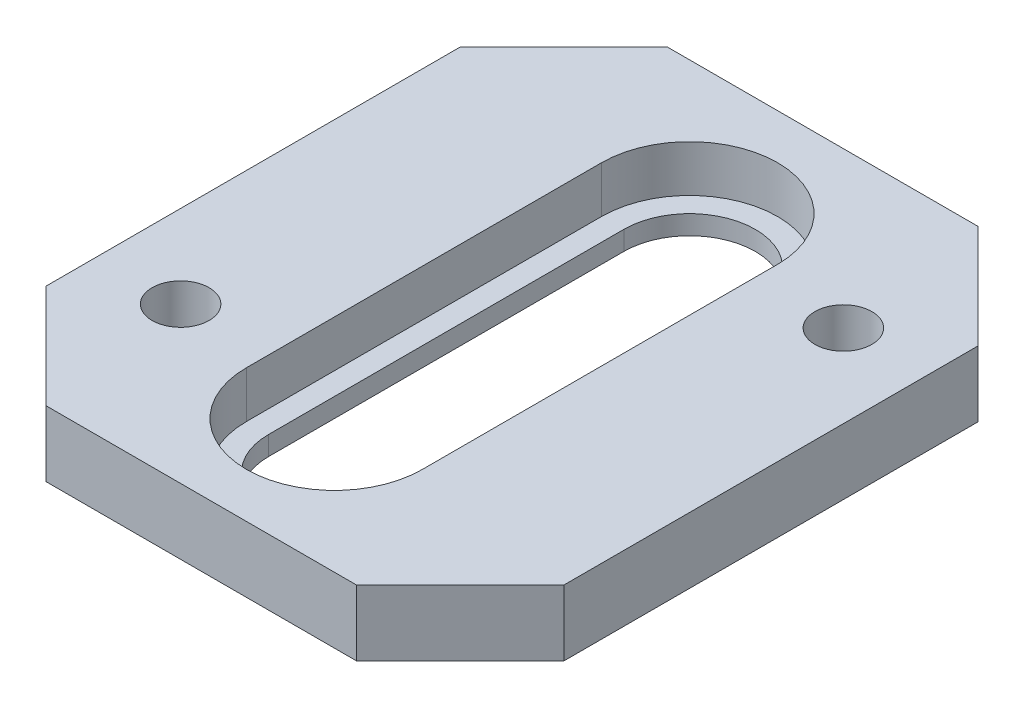
ISO-10303-21;
HEADER;
FILE_DESCRIPTION(('STEP AP214'),'2;1');
FILE_NAME('part.step','',(''),(''),'','','');
FILE_SCHEMA(('AUTOMOTIVE_DESIGN { 1 0 10303 214 1 1 1 1 }'));
ENDSEC;
DATA;
#1=APPLICATION_CONTEXT('core data for automotive mechanical design processes');
#2=APPLICATION_PROTOCOL_DEFINITION('international standard','automotive_design',2000,#1);
#3=PRODUCT_CONTEXT('',#1,'mechanical');
#4=PRODUCT('Part','Part','',(#3));
#5=PRODUCT_RELATED_PRODUCT_CATEGORY('part','',(#4));
#6=PRODUCT_DEFINITION_FORMATION('','',#4);
#7=PRODUCT_DEFINITION_CONTEXT('part definition',#1,'design');
#8=PRODUCT_DEFINITION('design','',#6,#7);
#9=PRODUCT_DEFINITION_SHAPE('','',#8);
#10=(LENGTH_UNIT() NAMED_UNIT(*) SI_UNIT(.MILLI.,.METRE.));
#11=(NAMED_UNIT(*) PLANE_ANGLE_UNIT() SI_UNIT($,.RADIAN.));
#12=(NAMED_UNIT(*) SI_UNIT($,.STERADIAN.) SOLID_ANGLE_UNIT());
#13=UNCERTAINTY_MEASURE_WITH_UNIT(LENGTH_MEASURE(1.E-05),#10,'distance_accuracy_value','');
#14=(GEOMETRIC_REPRESENTATION_CONTEXT(3) GLOBAL_UNCERTAINTY_ASSIGNED_CONTEXT((#13)) GLOBAL_UNIT_ASSIGNED_CONTEXT((#10,
#11,#12)) REPRESENTATION_CONTEXT('',''));
#15=CARTESIAN_POINT('',(0.,0.,0.));
#16=DIRECTION('',(0.,0.,1.));
#17=DIRECTION('',(1.,0.,0.));
#18=AXIS2_PLACEMENT_3D('',#15,#16,#17);
#19=CARTESIAN_POINT('',(328.825898213794,6.35,344.555667315375));
#20=DIRECTION('',(0.,1.,0.));
#21=DIRECTION('',(1.,0.,0.));
#22=AXIS2_PLACEMENT_3D('',#19,#20,#21);
#23=PLANE('',#22);
#24=DIRECTION('',(0.,0.,-1.));
#25=VECTOR('',#24,1.);
#26=CARTESIAN_POINT('',(320.325898213792,6.35,353.130197384601));
#27=LINE('',#26,#25);
#28=CARTESIAN_POINT('',(320.325898213792,6.34999999999934,361.704727453826));
#29=VERTEX_POINT('',#28);
#30=CARTESIAN_POINT('',(320.325898213792,6.34999999999934,327.406607176923));
#31=VERTEX_POINT('',#30);
#32=EDGE_CURVE('E233',#29,#31,#27,.T.);
#33=ORIENTED_EDGE('',*,*,#32,.T.);
#34=CARTESIAN_POINT('',(328.825898213792,6.35,327.406607176923));
#35=DIRECTION('',(0.,-1.,0.));
#36=DIRECTION('',(1.,0.,0.));
#37=AXIS2_PLACEMENT_3D('',#34,#35,#36);
#38=CIRCLE('',#37,8.5);
#39=CARTESIAN_POINT('',(337.325898213792,6.34999999999934,327.406607176923));
#40=VERTEX_POINT('',#39);
#41=EDGE_CURVE('E313',#31,#40,#38,.T.);
#42=ORIENTED_EDGE('',*,*,#41,.T.);
#43=DIRECTION('',(0.,0.,1.));
#44=VECTOR('',#43,1.);
#45=CARTESIAN_POINT('',(337.325898213792,6.35,335.981137246149));
#46=LINE('',#45,#44);
#47=CARTESIAN_POINT('',(337.325898213792,6.34999999999934,361.704727453826));
#48=VERTEX_POINT('',#47);
#49=EDGE_CURVE('E303',#40,#48,#46,.T.);
#50=ORIENTED_EDGE('',*,*,#49,.T.);
#51=CARTESIAN_POINT('',(328.825898213792,6.35,361.704727453826));
#52=DIRECTION('',(0.,-1.,0.));
#53=DIRECTION('',(-1.,0.,0.));
#54=AXIS2_PLACEMENT_3D('',#51,#52,#53);
#55=CIRCLE('',#54,8.5);
#56=EDGE_CURVE('E293',#48,#29,#55,.T.);
#57=ORIENTED_EDGE('',*,*,#56,.T.);
#58=EDGE_LOOP('',(#33,#42,#50,#57));
#59=FACE_BOUND('',#58,.T.);
#60=CARTESIAN_POINT('',(311.825898213794,6.35,359.555667315375));
#61=DIRECTION('',(0.,-1.,0.));
#62=DIRECTION('',(0.,0.,-1.));
#63=AXIS2_PLACEMENT_3D('',#60,#61,#62);
#64=CIRCLE('',#63,2.75);
#65=CARTESIAN_POINT('',(311.825898213794,6.35,362.305667315375));
#66=VERTEX_POINT('',#65);
#67=EDGE_CURVE('E354',#66,#66,#64,.T.);
#68=ORIENTED_EDGE('',*,*,#67,.T.);
#69=EDGE_LOOP('',(#68));
#70=FACE_BOUND('',#69,.T.);
#71=CARTESIAN_POINT('',(345.825898213794,6.35,329.555667315375));
#72=DIRECTION('',(0.,-1.,0.));
#73=DIRECTION('',(0.,0.,-1.));
#74=AXIS2_PLACEMENT_3D('',#71,#72,#73);
#75=CIRCLE('',#74,2.75);
#76=CARTESIAN_POINT('',(345.825898213794,6.35,332.305667315375));
#77=VERTEX_POINT('',#76);
#78=EDGE_CURVE('E348',#77,#77,#75,.T.);
#79=ORIENTED_EDGE('',*,*,#78,.T.);
#80=EDGE_LOOP('',(#79));
#81=FACE_BOUND('',#80,.T.);
#82=DIRECTION('',(0.707106781186548,0.,-0.707106781186548));
#83=VECTOR('',#82,1.);
#84=CARTESIAN_POINT('',(307.575898213794,6.35,320.805667315375));
#85=LINE('',#84,#83);
#86=CARTESIAN_POINT('',(303.825898213794,6.35,324.555667315375));
#87=VERTEX_POINT('',#86);
#88=CARTESIAN_POINT('',(313.825898213794,6.35,314.555667315375));
#89=VERTEX_POINT('',#88);
#90=EDGE_CURVE('E356',#87,#89,#85,.T.);
#91=ORIENTED_EDGE('',*,*,#90,.F.);
#92=DIRECTION('',(0.,0.,1.));
#93=VECTOR('',#92,1.);
#94=CARTESIAN_POINT('',(303.825898213794,6.35,374.555667315375));
#95=LINE('',#94,#93);
#96=CARTESIAN_POINT('',(303.825898213794,6.35,364.555667315375));
#97=VERTEX_POINT('',#96);
#98=EDGE_CURVE('E11',#87,#97,#95,.T.);
#99=ORIENTED_EDGE('',*,*,#98,.T.);
#100=DIRECTION('',(-0.707106781186548,0.,-0.707106781186548));
#101=VECTOR('',#100,1.);
#102=CARTESIAN_POINT('',(307.575898213794,6.35,368.305667315375));
#103=LINE('',#102,#101);
#104=CARTESIAN_POINT('',(313.825898213794,6.35,374.555667315375));
#105=VERTEX_POINT('',#104);
#106=EDGE_CURVE('E194',#105,#97,#103,.T.);
#107=ORIENTED_EDGE('',*,*,#106,.F.);
#108=DIRECTION('',(1.,0.,0.));
#109=VECTOR('',#108,1.);
#110=CARTESIAN_POINT('',(353.825898213794,6.35,374.555667315375));
#111=LINE('',#110,#109);
#112=CARTESIAN_POINT('',(343.825898213794,6.35,374.555667315375));
#113=VERTEX_POINT('',#112);
#114=EDGE_CURVE('E273',#105,#113,#111,.T.);
#115=ORIENTED_EDGE('',*,*,#114,.T.);
#116=DIRECTION('',(-0.707106781186548,0.,0.707106781186548));
#117=VECTOR('',#116,1.);
#118=CARTESIAN_POINT('',(350.075898213794,6.35,368.305667315375));
#119=LINE('',#118,#117);
#120=CARTESIAN_POINT('',(353.825898213794,6.35,364.555667315375));
#121=VERTEX_POINT('',#120);
#122=EDGE_CURVE('E279',#121,#113,#119,.T.);
#123=ORIENTED_EDGE('',*,*,#122,.F.);
#124=DIRECTION('',(0.,0.,-1.));
#125=VECTOR('',#124,1.);
#126=CARTESIAN_POINT('',(353.825898213794,6.35,314.555667315375));
#127=LINE('',#126,#125);
#128=CARTESIAN_POINT('',(353.825898213794,6.35,324.555667315375));
#129=VERTEX_POINT('',#128);
#130=EDGE_CURVE('E25',#121,#129,#127,.T.);
#131=ORIENTED_EDGE('',*,*,#130,.T.);
#132=DIRECTION('',(0.707106781186548,0.,0.707106781186548));
#133=VECTOR('',#132,1.);
#134=CARTESIAN_POINT('',(350.075898213794,6.35,320.805667315375));
#135=LINE('',#134,#133);
#136=CARTESIAN_POINT('',(343.825898213794,6.35,314.555667315375));
#137=VERTEX_POINT('',#136);
#138=EDGE_CURVE('E195',#137,#129,#135,.T.);
#139=ORIENTED_EDGE('',*,*,#138,.F.);
#140=DIRECTION('',(-1.,0.,0.));
#141=VECTOR('',#140,1.);
#142=CARTESIAN_POINT('',(303.825898213794,6.35,314.555667315375));
#143=LINE('',#142,#141);
#144=EDGE_CURVE('E247',#137,#89,#143,.T.);
#145=ORIENTED_EDGE('',*,*,#144,.T.);
#146=EDGE_LOOP('',(#91,#99,#107,#115,#123,#131,#139,#145));
#147=FACE_BOUND('',#146,.T.);
#148=ADVANCED_FACE('F17',(#59,#70,#81,#147),#23,.T.);
#149=CARTESIAN_POINT('',(303.825898213794,0.,314.555667315375));
#150=DIRECTION('',(-1.,0.,0.));
#151=DIRECTION('',(0.,0.,1.));
#152=AXIS2_PLACEMENT_3D('',#149,#150,#151);
#153=PLANE('',#152);
#154=DIRECTION('',(0.,1.,0.));
#155=VECTOR('',#154,1.);
#156=CARTESIAN_POINT('',(303.825898213794,0.,324.555667315375));
#157=LINE('',#156,#155);
#158=CARTESIAN_POINT('',(303.825898213794,0.,324.555667315375));
#159=VERTEX_POINT('',#158);
#160=EDGE_CURVE('E220',#159,#87,#157,.T.);
#161=ORIENTED_EDGE('',*,*,#160,.F.);
#162=DIRECTION('',(0.,0.,-1.));
#163=VECTOR('',#162,1.);
#164=CARTESIAN_POINT('',(303.825898213794,0.,374.555667315375));
#165=LINE('',#164,#163);
#166=CARTESIAN_POINT('',(303.825898213794,0.,364.555667315375));
#167=VERTEX_POINT('',#166);
#168=EDGE_CURVE('E224',#167,#159,#165,.T.);
#169=ORIENTED_EDGE('',*,*,#168,.F.);
#170=DIRECTION('',(0.,-1.,0.));
#171=VECTOR('',#170,1.);
#172=CARTESIAN_POINT('',(303.825898213794,0.,364.555667315375));
#173=LINE('',#172,#171);
#174=EDGE_CURVE('E262',#97,#167,#173,.T.);
#175=ORIENTED_EDGE('',*,*,#174,.F.);
#176=ORIENTED_EDGE('',*,*,#98,.F.);
#177=EDGE_LOOP('',(#161,#169,#175,#176));
#178=FACE_BOUND('',#177,.T.);
#179=ADVANCED_FACE('F391',(#178),#153,.T.);
#180=CARTESIAN_POINT('',(353.825898213794,0.,374.555667315375));
#181=DIRECTION('',(1.,0.,0.));
#182=DIRECTION('',(0.,1.,0.));
#183=AXIS2_PLACEMENT_3D('',#180,#181,#182);
#184=PLANE('',#183);
#185=DIRECTION('',(0.,-1.,0.));
#186=VECTOR('',#185,1.);
#187=CARTESIAN_POINT('',(353.825898213794,0.,324.555667315375));
#188=LINE('',#187,#186);
#189=CARTESIAN_POINT('',(353.825898213794,0.,324.555667315375));
#190=VERTEX_POINT('',#189);
#191=EDGE_CURVE('E184',#129,#190,#188,.T.);
#192=ORIENTED_EDGE('',*,*,#191,.F.);
#193=ORIENTED_EDGE('',*,*,#130,.F.);
#194=DIRECTION('',(0.,1.,0.));
#195=VECTOR('',#194,1.);
#196=CARTESIAN_POINT('',(353.825898213794,0.,364.555667315375));
#197=LINE('',#196,#195);
#198=CARTESIAN_POINT('',(353.825898213794,0.,364.555667315375));
#199=VERTEX_POINT('',#198);
#200=EDGE_CURVE('E203',#199,#121,#197,.T.);
#201=ORIENTED_EDGE('',*,*,#200,.F.);
#202=DIRECTION('',(0.,0.,1.));
#203=VECTOR('',#202,1.);
#204=CARTESIAN_POINT('',(353.825898213794,0.,314.555667315375));
#205=LINE('',#204,#203);
#206=EDGE_CURVE('E196',#190,#199,#205,.T.);
#207=ORIENTED_EDGE('',*,*,#206,.F.);
#208=EDGE_LOOP('',(#192,#193,#201,#207));
#209=FACE_BOUND('',#208,.T.);
#210=ADVANCED_FACE('F200',(#209),#184,.T.);
#211=CARTESIAN_POINT('',(328.825898213792,6.34999999999934,361.704727453826));
#212=DIRECTION('',(0.,-1.,0.));
#213=DIRECTION('',(-1.,0.,0.));
#214=AXIS2_PLACEMENT_3D('',#211,#212,#213);
#215=CYLINDRICAL_SURFACE('',#214,6.35);
#216=CARTESIAN_POINT('',(328.825898213792,1.84999999999934,361.704727453826));
#217=DIRECTION('',(0.,1.,0.));
#218=DIRECTION('',(-1.,0.,0.));
#219=AXIS2_PLACEMENT_3D('',#216,#217,#218);
#220=CIRCLE('',#219,6.35);
#221=CARTESIAN_POINT('',(322.475898213792,1.84999999999934,361.704727453826));
#222=VERTEX_POINT('',#221);
#223=CARTESIAN_POINT('',(335.175898213792,1.84999999999934,361.704727453826));
#224=VERTEX_POINT('',#223);
#225=EDGE_CURVE('E257',#222,#224,#220,.T.);
#226=ORIENTED_EDGE('',*,*,#225,.T.);
#227=DIRECTION('',(0.,-1.,0.));
#228=VECTOR('',#227,1.);
#229=CARTESIAN_POINT('',(335.175898213792,6.34999999999934,361.704727453826));
#230=LINE('',#229,#228);
#231=CARTESIAN_POINT('',(335.175898213792,0.,361.704727453826));
#232=VERTEX_POINT('',#231);
#233=EDGE_CURVE('E50',#224,#232,#230,.T.);
#234=ORIENTED_EDGE('',*,*,#233,.T.);
#235=CARTESIAN_POINT('',(328.825898213792,0.,361.704727453826));
#236=DIRECTION('',(0.,1.,0.));
#237=DIRECTION('',(-1.,0.,0.));
#238=AXIS2_PLACEMENT_3D('',#235,#236,#237);
#239=CIRCLE('',#238,6.35);
#240=CARTESIAN_POINT('',(322.475898213792,0.,361.704727453826));
#241=VERTEX_POINT('',#240);
#242=EDGE_CURVE('E244',#241,#232,#239,.T.);
#243=ORIENTED_EDGE('',*,*,#242,.F.);
#244=DIRECTION('',(0.,-1.,0.));
#245=VECTOR('',#244,1.);
#246=CARTESIAN_POINT('',(322.475898213792,6.34999999999934,361.704727453826));
#247=LINE('',#246,#245);
#248=EDGE_CURVE('E40',#222,#241,#247,.T.);
#249=ORIENTED_EDGE('',*,*,#248,.F.);
#250=EDGE_LOOP('',(#226,#234,#243,#249));
#251=FACE_BOUND('',#250,.T.);
#252=ADVANCED_FACE('F691',(#251),#215,.F.);
#253=CARTESIAN_POINT('',(322.475898213792,6.34999999999934,361.704727453826));
#254=DIRECTION('',(-1.,0.,0.));
#255=DIRECTION('',(0.,0.,1.));
#256=AXIS2_PLACEMENT_3D('',#253,#254,#255);
#257=PLANE('',#256);
#258=DIRECTION('',(0.,0.,1.));
#259=VECTOR('',#258,1.);
#260=CARTESIAN_POINT('',(322.475898213792,1.84999999999934,353.1301973846));
#261=LINE('',#260,#259);
#262=CARTESIAN_POINT('',(322.475898213792,1.84999999999934,327.406607176923));
#263=VERTEX_POINT('',#262);
#264=EDGE_CURVE('E260',#263,#222,#261,.T.);
#265=ORIENTED_EDGE('',*,*,#264,.T.);
#266=ORIENTED_EDGE('',*,*,#248,.T.);
#267=DIRECTION('',(0.,0.,1.));
#268=VECTOR('',#267,1.);
#269=CARTESIAN_POINT('',(322.475898213792,0.,353.130197384601));
#270=LINE('',#269,#268);
#271=CARTESIAN_POINT('',(322.475898213792,0.,327.406607176923));
#272=VERTEX_POINT('',#271);
#273=EDGE_CURVE('E241',#272,#241,#270,.T.);
#274=ORIENTED_EDGE('',*,*,#273,.F.);
#275=DIRECTION('',(0.,-1.,0.));
#276=VECTOR('',#275,1.);
#277=CARTESIAN_POINT('',(322.475898213792,6.34999999999934,327.406607176923));
#278=LINE('',#277,#276);
#279=EDGE_CURVE('E327',#263,#272,#278,.T.);
#280=ORIENTED_EDGE('',*,*,#279,.F.);
#281=EDGE_LOOP('',(#265,#266,#274,#280));
#282=FACE_BOUND('',#281,.T.);
#283=ADVANCED_FACE('F655',(#282),#257,.F.);
#284=CARTESIAN_POINT('',(328.825898213792,6.34999999999934,327.406607176923));
#285=DIRECTION('',(0.,-1.,0.));
#286=DIRECTION('',(1.,0.,0.));
#287=AXIS2_PLACEMENT_3D('',#284,#285,#286);
#288=CYLINDRICAL_SURFACE('',#287,6.35);
#289=CARTESIAN_POINT('',(328.825898213792,1.84999999999934,327.406607176923));
#290=DIRECTION('',(0.,1.,0.));
#291=DIRECTION('',(1.,0.,0.));
#292=AXIS2_PLACEMENT_3D('',#289,#290,#291);
#293=CIRCLE('',#292,6.35);
#294=CARTESIAN_POINT('',(335.175898213792,1.84999999999934,327.406607176923));
#295=VERTEX_POINT('',#294);
#296=EDGE_CURVE('E320',#295,#263,#293,.T.);
#297=ORIENTED_EDGE('',*,*,#296,.T.);
#298=ORIENTED_EDGE('',*,*,#279,.T.);
#299=CARTESIAN_POINT('',(328.825898213792,0.,327.406607176923));
#300=DIRECTION('',(0.,1.,0.));
#301=DIRECTION('',(1.,0.,0.));
#302=AXIS2_PLACEMENT_3D('',#299,#300,#301);
#303=CIRCLE('',#302,6.35);
#304=CARTESIAN_POINT('',(335.175898213792,0.,327.406607176923));
#305=VERTEX_POINT('',#304);
#306=EDGE_CURVE('E236',#305,#272,#303,.T.);
#307=ORIENTED_EDGE('',*,*,#306,.F.);
#308=DIRECTION('',(0.,-1.,0.));
#309=VECTOR('',#308,1.);
#310=CARTESIAN_POINT('',(335.175898213792,6.34999999999934,327.406607176923));
#311=LINE('',#310,#309);
#312=EDGE_CURVE('E219',#295,#305,#311,.T.);
#313=ORIENTED_EDGE('',*,*,#312,.F.);
#314=EDGE_LOOP('',(#297,#298,#307,#313));
#315=FACE_BOUND('',#314,.T.);
#316=ADVANCED_FACE('F578',(#315),#288,.F.);
#317=CARTESIAN_POINT('',(335.175898213792,6.34999999999934,327.406607176923));
#318=DIRECTION('',(1.,0.,0.));
#319=DIRECTION('',(0.,0.,1.));
#320=AXIS2_PLACEMENT_3D('',#317,#318,#319);
#321=PLANE('',#320);
#322=DIRECTION('',(0.,0.,-1.));
#323=VECTOR('',#322,1.);
#324=CARTESIAN_POINT('',(335.175898213792,1.84999999999934,335.981137246149));
#325=LINE('',#324,#323);
#326=EDGE_CURVE('E321',#224,#295,#325,.T.);
#327=ORIENTED_EDGE('',*,*,#326,.T.);
#328=ORIENTED_EDGE('',*,*,#312,.T.);
#329=DIRECTION('',(0.,0.,-1.));
#330=VECTOR('',#329,1.);
#331=CARTESIAN_POINT('',(335.175898213792,0.,335.981137246149));
#332=LINE('',#331,#330);
#333=EDGE_CURVE('E226',#232,#305,#332,.T.);
#334=ORIENTED_EDGE('',*,*,#333,.F.);
#335=ORIENTED_EDGE('',*,*,#233,.F.);
#336=EDGE_LOOP('',(#327,#328,#334,#335));
#337=FACE_BOUND('',#336,.T.);
#338=ADVANCED_FACE('F575',(#337),#321,.F.);
#339=CARTESIAN_POINT('',(328.825898213792,1.84999999999934,344.555667315375));
#340=DIRECTION('',(0.,1.,0.));
#341=DIRECTION('',(1.,0.,0.));
#342=AXIS2_PLACEMENT_3D('',#339,#340,#341);
#343=PLANE('',#342);
#344=ORIENTED_EDGE('',*,*,#296,.F.);
#345=ORIENTED_EDGE('',*,*,#326,.F.);
#346=ORIENTED_EDGE('',*,*,#225,.F.);
#347=ORIENTED_EDGE('',*,*,#264,.F.);
#348=EDGE_LOOP('',(#344,#345,#346,#347));
#349=FACE_BOUND('',#348,.T.);
#350=CARTESIAN_POINT('',(328.825898213792,1.84999999999934,327.406607176923));
#351=DIRECTION('',(0.,-1.,0.));
#352=DIRECTION('',(1.,0.,0.));
#353=AXIS2_PLACEMENT_3D('',#350,#351,#352);
#354=CIRCLE('',#353,8.5);
#355=CARTESIAN_POINT('',(320.325898213792,1.84999999999934,327.406607176923));
#356=VERTEX_POINT('',#355);
#357=CARTESIAN_POINT('',(337.325898213792,1.84999999999934,327.406607176923));
#358=VERTEX_POINT('',#357);
#359=EDGE_CURVE('E314',#356,#358,#354,.T.);
#360=ORIENTED_EDGE('',*,*,#359,.F.);
#361=DIRECTION('',(0.,0.,-1.));
#362=VECTOR('',#361,1.);
#363=CARTESIAN_POINT('',(320.325898213792,1.84999999999934,327.406607176923));
#364=LINE('',#363,#362);
#365=CARTESIAN_POINT('',(320.325898213792,1.84999999999934,361.704727453826));
#366=VERTEX_POINT('',#365);
#367=EDGE_CURVE('E235',#366,#356,#364,.T.);
#368=ORIENTED_EDGE('',*,*,#367,.F.);
#369=CARTESIAN_POINT('',(328.825898213792,1.84999999999934,361.704727453826));
#370=DIRECTION('',(0.,-1.,0.));
#371=DIRECTION('',(-1.,0.,0.));
#372=AXIS2_PLACEMENT_3D('',#369,#370,#371);
#373=CIRCLE('',#372,8.5);
#374=CARTESIAN_POINT('',(337.325898213792,1.84999999999934,361.704727453826));
#375=VERTEX_POINT('',#374);
#376=EDGE_CURVE('E299',#375,#366,#373,.T.);
#377=ORIENTED_EDGE('',*,*,#376,.F.);
#378=DIRECTION('',(0.,0.,1.));
#379=VECTOR('',#378,1.);
#380=CARTESIAN_POINT('',(337.325898213792,1.84999999999934,361.704727453826));
#381=LINE('',#380,#379);
#382=EDGE_CURVE('E309',#358,#375,#381,.T.);
#383=ORIENTED_EDGE('',*,*,#382,.F.);
#384=EDGE_LOOP('',(#360,#368,#377,#383));
#385=FACE_BOUND('',#384,.T.);
#386=ADVANCED_FACE('F580',(#349,#385),#343,.T.);
#387=CARTESIAN_POINT('',(328.825898213792,6.34999999999934,327.406607176923));
#388=DIRECTION('',(0.,-1.,0.));
#389=DIRECTION('',(1.,0.,0.));
#390=AXIS2_PLACEMENT_3D('',#387,#388,#389);
#391=CYLINDRICAL_SURFACE('',#390,8.5);
#392=ORIENTED_EDGE('',*,*,#41,.F.);
#393=DIRECTION('',(0.,-1.,0.));
#394=VECTOR('',#393,1.);
#395=CARTESIAN_POINT('',(320.325898213792,6.34999999999934,327.406607176923));
#396=LINE('',#395,#394);
#397=EDGE_CURVE('E287',#31,#356,#396,.T.);
#398=ORIENTED_EDGE('',*,*,#397,.T.);
#399=ORIENTED_EDGE('',*,*,#359,.T.);
#400=DIRECTION('',(0.,-1.,0.));
#401=VECTOR('',#400,1.);
#402=CARTESIAN_POINT('',(337.325898213792,6.34999999999934,327.406607176923));
#403=LINE('',#402,#401);
#404=EDGE_CURVE('E308',#40,#358,#403,.T.);
#405=ORIENTED_EDGE('',*,*,#404,.F.);
#406=EDGE_LOOP('',(#392,#398,#399,#405));
#407=FACE_BOUND('',#406,.T.);
#408=ADVANCED_FACE('F657',(#407),#391,.F.);
#409=CARTESIAN_POINT('',(337.325898213792,6.34999999999934,327.406607176923));
#410=DIRECTION('',(1.,0.,0.));
#411=DIRECTION('',(0.,0.,1.));
#412=AXIS2_PLACEMENT_3D('',#409,#410,#411);
#413=PLANE('',#412);
#414=ORIENTED_EDGE('',*,*,#49,.F.);
#415=ORIENTED_EDGE('',*,*,#404,.T.);
#416=ORIENTED_EDGE('',*,*,#382,.T.);
#417=DIRECTION('',(0.,-1.,0.));
#418=VECTOR('',#417,1.);
#419=CARTESIAN_POINT('',(337.325898213792,6.34999999999934,361.704727453826));
#420=LINE('',#419,#418);
#421=EDGE_CURVE('E296',#48,#375,#420,.T.);
#422=ORIENTED_EDGE('',*,*,#421,.F.);
#423=EDGE_LOOP('',(#414,#415,#416,#422));
#424=FACE_BOUND('',#423,.T.);
#425=ADVANCED_FACE('F664',(#424),#413,.F.);
#426=CARTESIAN_POINT('',(328.825898213792,6.34999999999934,361.704727453826));
#427=DIRECTION('',(0.,-1.,0.));
#428=DIRECTION('',(-1.,0.,0.));
#429=AXIS2_PLACEMENT_3D('',#426,#427,#428);
#430=CYLINDRICAL_SURFACE('',#429,8.5);
#431=ORIENTED_EDGE('',*,*,#56,.F.);
#432=ORIENTED_EDGE('',*,*,#421,.T.);
#433=ORIENTED_EDGE('',*,*,#376,.T.);
#434=DIRECTION('',(0.,-1.,0.));
#435=VECTOR('',#434,1.);
#436=CARTESIAN_POINT('',(320.325898213792,6.34999999999934,361.704727453826));
#437=LINE('',#436,#435);
#438=EDGE_CURVE('E229',#29,#366,#437,.T.);
#439=ORIENTED_EDGE('',*,*,#438,.F.);
#440=EDGE_LOOP('',(#431,#432,#433,#439));
#441=FACE_BOUND('',#440,.T.);
#442=ADVANCED_FACE('F411',(#441),#430,.F.);
#443=CARTESIAN_POINT('',(320.325898213792,6.34999999999934,361.704727453826));
#444=DIRECTION('',(-1.,0.,0.));
#445=DIRECTION('',(0.,0.,1.));
#446=AXIS2_PLACEMENT_3D('',#443,#444,#445);
#447=PLANE('',#446);
#448=ORIENTED_EDGE('',*,*,#32,.F.);
#449=ORIENTED_EDGE('',*,*,#438,.T.);
#450=ORIENTED_EDGE('',*,*,#367,.T.);
#451=ORIENTED_EDGE('',*,*,#397,.F.);
#452=EDGE_LOOP('',(#448,#449,#450,#451));
#453=FACE_BOUND('',#452,.T.);
#454=ADVANCED_FACE('F401',(#453),#447,.F.);
#455=CARTESIAN_POINT('',(348.825898213794,0.,369.555667315375));
#456=DIRECTION('',(0.707106781186548,0.,0.707106781186548));
#457=DIRECTION('',(0.,-1.,0.));
#458=AXIS2_PLACEMENT_3D('',#455,#456,#457);
#459=PLANE('',#458);
#460=ORIENTED_EDGE('',*,*,#122,.T.);
#461=DIRECTION('',(0.,-1.,0.));
#462=VECTOR('',#461,1.);
#463=CARTESIAN_POINT('',(343.825898213794,0.,374.555667315375));
#464=LINE('',#463,#462);
#465=CARTESIAN_POINT('',(343.825898213794,0.,374.555667315375));
#466=VERTEX_POINT('',#465);
#467=EDGE_CURVE('E271',#113,#466,#464,.T.);
#468=ORIENTED_EDGE('',*,*,#467,.T.);
#469=DIRECTION('',(0.707106781186548,0.,-0.707106781186548));
#470=VECTOR('',#469,1.);
#471=CARTESIAN_POINT('',(350.075898213794,0.,368.305667315375));
#472=LINE('',#471,#470);
#473=EDGE_CURVE('E206',#466,#199,#472,.T.);
#474=ORIENTED_EDGE('',*,*,#473,.T.);
#475=ORIENTED_EDGE('',*,*,#200,.T.);
#476=EDGE_LOOP('',(#460,#468,#474,#475));
#477=FACE_BOUND('',#476,.T.);
#478=ADVANCED_FACE('F399',(#477),#459,.T.);
#479=CARTESIAN_POINT('',(303.825898213794,0.,374.555667315375));
#480=DIRECTION('',(0.,0.,1.));
#481=DIRECTION('',(1.,0.,0.));
#482=AXIS2_PLACEMENT_3D('',#479,#480,#481);
#483=PLANE('',#482);
#484=DIRECTION('',(0.,1.,0.));
#485=VECTOR('',#484,1.);
#486=CARTESIAN_POINT('',(313.825898213794,0.,374.555667315375));
#487=LINE('',#486,#485);
#488=CARTESIAN_POINT('',(313.825898213794,0.,374.555667315375));
#489=VERTEX_POINT('',#488);
#490=EDGE_CURVE('E270',#489,#105,#487,.T.);
#491=ORIENTED_EDGE('',*,*,#490,.F.);
#492=DIRECTION('',(-1.,0.,0.));
#493=VECTOR('',#492,1.);
#494=CARTESIAN_POINT('',(353.825898213794,0.,374.555667315375));
#495=LINE('',#494,#493);
#496=EDGE_CURVE('E351',#466,#489,#495,.T.);
#497=ORIENTED_EDGE('',*,*,#496,.F.);
#498=ORIENTED_EDGE('',*,*,#467,.F.);
#499=ORIENTED_EDGE('',*,*,#114,.F.);
#500=EDGE_LOOP('',(#491,#497,#498,#499));
#501=FACE_BOUND('',#500,.T.);
#502=ADVANCED_FACE('F382',(#501),#483,.T.);
#503=CARTESIAN_POINT('',(308.825898213794,0.,369.555667315375));
#504=DIRECTION('',(-0.707106781186548,0.,0.707106781186548));
#505=DIRECTION('',(0.,1.,0.));
#506=AXIS2_PLACEMENT_3D('',#503,#504,#505);
#507=PLANE('',#506);
#508=ORIENTED_EDGE('',*,*,#106,.T.);
#509=ORIENTED_EDGE('',*,*,#174,.T.);
#510=DIRECTION('',(0.707106781186548,0.,0.707106781186548));
#511=VECTOR('',#510,1.);
#512=CARTESIAN_POINT('',(307.575898213794,0.,368.305667315375));
#513=LINE('',#512,#511);
#514=EDGE_CURVE('E227',#167,#489,#513,.T.);
#515=ORIENTED_EDGE('',*,*,#514,.T.);
#516=ORIENTED_EDGE('',*,*,#490,.T.);
#517=EDGE_LOOP('',(#508,#509,#515,#516));
#518=FACE_BOUND('',#517,.T.);
#519=ADVANCED_FACE('F387',(#518),#507,.T.);
#520=CARTESIAN_POINT('',(348.825898213794,0.,319.555667315375));
#521=DIRECTION('',(0.707106781186548,0.,-0.707106781186548));
#522=DIRECTION('',(0.,-1.,0.));
#523=AXIS2_PLACEMENT_3D('',#520,#521,#522);
#524=PLANE('',#523);
#525=ORIENTED_EDGE('',*,*,#138,.T.);
#526=ORIENTED_EDGE('',*,*,#191,.T.);
#527=DIRECTION('',(-0.707106781186548,0.,-0.707106781186548));
#528=VECTOR('',#527,1.);
#529=CARTESIAN_POINT('',(350.075898213794,0.,320.805667315375));
#530=LINE('',#529,#528);
#531=CARTESIAN_POINT('',(343.825898213794,0.,314.555667315375));
#532=VERTEX_POINT('',#531);
#533=EDGE_CURVE('E189',#190,#532,#530,.T.);
#534=ORIENTED_EDGE('',*,*,#533,.T.);
#535=DIRECTION('',(0.,1.,0.));
#536=VECTOR('',#535,1.);
#537=CARTESIAN_POINT('',(343.825898213794,0.,314.555667315375));
#538=LINE('',#537,#536);
#539=EDGE_CURVE('E252',#532,#137,#538,.T.);
#540=ORIENTED_EDGE('',*,*,#539,.T.);
#541=EDGE_LOOP('',(#525,#526,#534,#540));
#542=FACE_BOUND('',#541,.T.);
#543=ADVANCED_FACE('F190',(#542),#524,.T.);
#544=CARTESIAN_POINT('',(353.825898213794,0.,314.555667315375));
#545=DIRECTION('',(0.,0.,-1.));
#546=DIRECTION('',(0.,-1.,0.));
#547=AXIS2_PLACEMENT_3D('',#544,#545,#546);
#548=PLANE('',#547);
#549=DIRECTION('',(0.,-1.,0.));
#550=VECTOR('',#549,1.);
#551=CARTESIAN_POINT('',(313.825898213794,0.,314.555667315375));
#552=LINE('',#551,#550);
#553=CARTESIAN_POINT('',(313.825898213794,0.,314.555667315375));
#554=VERTEX_POINT('',#553);
#555=EDGE_CURVE('E359',#89,#554,#552,.T.);
#556=ORIENTED_EDGE('',*,*,#555,.F.);
#557=ORIENTED_EDGE('',*,*,#144,.F.);
#558=ORIENTED_EDGE('',*,*,#539,.F.);
#559=DIRECTION('',(1.,0.,0.));
#560=VECTOR('',#559,1.);
#561=CARTESIAN_POINT('',(303.825898213794,0.,314.555667315375));
#562=LINE('',#561,#560);
#563=EDGE_CURVE('E209',#554,#532,#562,.T.);
#564=ORIENTED_EDGE('',*,*,#563,.F.);
#565=EDGE_LOOP('',(#556,#557,#558,#564));
#566=FACE_BOUND('',#565,.T.);
#567=ADVANCED_FACE('F398',(#566),#548,.T.);
#568=CARTESIAN_POINT('',(328.825898213794,0.,344.555667315375));
#569=DIRECTION('',(0.,1.,0.));
#570=DIRECTION('',(1.,0.,0.));
#571=AXIS2_PLACEMENT_3D('',#568,#569,#570);
#572=PLANE('',#571);
#573=ORIENTED_EDGE('',*,*,#333,.T.);
#574=ORIENTED_EDGE('',*,*,#306,.T.);
#575=ORIENTED_EDGE('',*,*,#273,.T.);
#576=ORIENTED_EDGE('',*,*,#242,.T.);
#577=EDGE_LOOP('',(#573,#574,#575,#576));
#578=FACE_BOUND('',#577,.T.);
#579=CARTESIAN_POINT('',(311.825898213794,0.,359.555667315375));
#580=DIRECTION('',(0.,1.,0.));
#581=DIRECTION('',(0.,0.,-1.));
#582=AXIS2_PLACEMENT_3D('',#579,#580,#581);
#583=CIRCLE('',#582,2.75);
#584=CARTESIAN_POINT('',(311.825898213794,0.,362.305667315375));
#585=VERTEX_POINT('',#584);
#586=EDGE_CURVE('E343',#585,#585,#583,.T.);
#587=ORIENTED_EDGE('',*,*,#586,.T.);
#588=EDGE_LOOP('',(#587));
#589=FACE_BOUND('',#588,.T.);
#590=CARTESIAN_POINT('',(345.825898213794,0.,329.555667315375));
#591=DIRECTION('',(0.,1.,0.));
#592=DIRECTION('',(0.,0.,-1.));
#593=AXIS2_PLACEMENT_3D('',#590,#591,#592);
#594=CIRCLE('',#593,2.75);
#595=CARTESIAN_POINT('',(345.825898213794,0.,332.305667315375));
#596=VERTEX_POINT('',#595);
#597=EDGE_CURVE('E432',#596,#596,#594,.T.);
#598=ORIENTED_EDGE('',*,*,#597,.T.);
#599=EDGE_LOOP('',(#598));
#600=FACE_BOUND('',#599,.T.);
#601=DIRECTION('',(-0.707106781186548,0.,0.707106781186548));
#602=VECTOR('',#601,1.);
#603=CARTESIAN_POINT('',(307.575898213794,0.,320.805667315375));
#604=LINE('',#603,#602);
#605=EDGE_CURVE('E365',#554,#159,#604,.T.);
#606=ORIENTED_EDGE('',*,*,#605,.F.);
#607=ORIENTED_EDGE('',*,*,#563,.T.);
#608=ORIENTED_EDGE('',*,*,#533,.F.);
#609=ORIENTED_EDGE('',*,*,#206,.T.);
#610=ORIENTED_EDGE('',*,*,#473,.F.);
#611=ORIENTED_EDGE('',*,*,#496,.T.);
#612=ORIENTED_EDGE('',*,*,#514,.F.);
#613=ORIENTED_EDGE('',*,*,#168,.T.);
#614=EDGE_LOOP('',(#606,#607,#608,#609,#610,#611,#612,#613));
#615=FACE_BOUND('',#614,.T.);
#616=ADVANCED_FACE('F207',(#578,#589,#600,#615),#572,.F.);
#617=CARTESIAN_POINT('',(308.825898213794,0.,319.555667315375));
#618=DIRECTION('',(-0.707106781186548,0.,-0.707106781186548));
#619=DIRECTION('',(-0.707106781186548,0.,0.707106781186548));
#620=AXIS2_PLACEMENT_3D('',#617,#618,#619);
#621=PLANE('',#620);
#622=ORIENTED_EDGE('',*,*,#90,.T.);
#623=ORIENTED_EDGE('',*,*,#555,.T.);
#624=ORIENTED_EDGE('',*,*,#605,.T.);
#625=ORIENTED_EDGE('',*,*,#160,.T.);
#626=EDGE_LOOP('',(#622,#623,#624,#625));
#627=FACE_BOUND('',#626,.T.);
#628=ADVANCED_FACE('F393',(#627),#621,.T.);
#629=CARTESIAN_POINT('',(311.825898213794,3.175,359.555667315375));
#630=DIRECTION('',(0.,1.,0.));
#631=DIRECTION('',(0.,0.,-1.));
#632=AXIS2_PLACEMENT_3D('',#629,#630,#631);
#633=CYLINDRICAL_SURFACE('',#632,2.75);
#634=ORIENTED_EDGE('',*,*,#586,.F.);
#635=DIRECTION('',(0.,1.,0.));
#636=VECTOR('',#635,1.);
#637=CARTESIAN_POINT('',(311.825898213794,3.175,362.305667315375));
#638=LINE('',#637,#636);
#639=EDGE_CURVE('E346',#585,#66,#638,.T.);
#640=ORIENTED_EDGE('',*,*,#639,.T.);
#641=ORIENTED_EDGE('',*,*,#67,.F.);
#642=ORIENTED_EDGE('',*,*,#639,.F.);
#643=EDGE_LOOP('',(#634,#640,#641,#642));
#644=FACE_BOUND('',#643,.T.);
#645=ADVANCED_FACE('F586',(#644),#633,.F.);
#646=CARTESIAN_POINT('',(345.825898213794,3.175,329.555667315375));
#647=DIRECTION('',(0.,1.,0.));
#648=DIRECTION('',(0.,0.,-1.));
#649=AXIS2_PLACEMENT_3D('',#646,#647,#648);
#650=CYLINDRICAL_SURFACE('',#649,2.75);
#651=ORIENTED_EDGE('',*,*,#597,.F.);
#652=DIRECTION('',(0.,1.,0.));
#653=VECTOR('',#652,1.);
#654=CARTESIAN_POINT('',(345.825898213794,3.175,332.305667315375));
#655=LINE('',#654,#653);
#656=EDGE_CURVE('E429',#596,#77,#655,.T.);
#657=ORIENTED_EDGE('',*,*,#656,.T.);
#658=ORIENTED_EDGE('',*,*,#78,.F.);
#659=ORIENTED_EDGE('',*,*,#656,.F.);
#660=EDGE_LOOP('',(#651,#657,#658,#659));
#661=FACE_BOUND('',#660,.T.);
#662=ADVANCED_FACE('F585',(#661),#650,.F.);
#663=CLOSED_SHELL('',(#148,#179,#210,#252,#283,#316,#338,#386,#408,#425,#442,#454,#478,#502,
#519,#543,#567,#616,#628,#645,#662));
#664=MANIFOLD_SOLID_BREP('B1',#663);
#665=ADVANCED_BREP_SHAPE_REPRESENTATION('',(#18,#664),#14);
#666=SHAPE_DEFINITION_REPRESENTATION(#9,#665);
ENDSEC;
END-ISO-10303-21;
